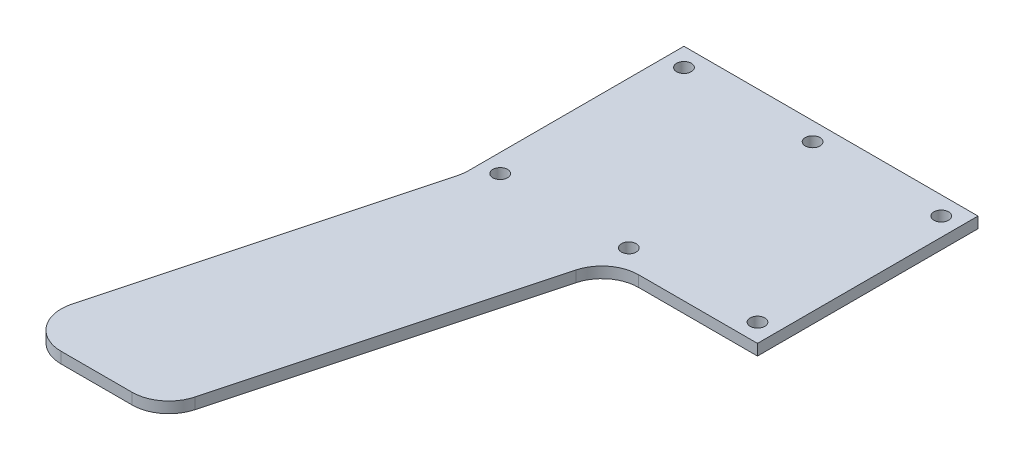
ISO-10303-21;
HEADER;
FILE_DESCRIPTION(('STEP AP214'),'2;1');
FILE_NAME('part.step','',(''),(''),'','','');
FILE_SCHEMA(('AUTOMOTIVE_DESIGN { 1 0 10303 214 1 1 1 1 }'));
ENDSEC;
DATA;
#1=APPLICATION_CONTEXT('core data for automotive mechanical design processes');
#2=APPLICATION_PROTOCOL_DEFINITION('international standard','automotive_design',2000,#1);
#3=PRODUCT_CONTEXT('',#1,'mechanical');
#4=PRODUCT('Part','Part','',(#3));
#5=PRODUCT_RELATED_PRODUCT_CATEGORY('part','',(#4));
#6=PRODUCT_DEFINITION_FORMATION('','',#4);
#7=PRODUCT_DEFINITION_CONTEXT('part definition',#1,'design');
#8=PRODUCT_DEFINITION('design','',#6,#7);
#9=PRODUCT_DEFINITION_SHAPE('','',#8);
#10=(LENGTH_UNIT() NAMED_UNIT(*) SI_UNIT(.MILLI.,.METRE.));
#11=(NAMED_UNIT(*) PLANE_ANGLE_UNIT() SI_UNIT($,.RADIAN.));
#12=(NAMED_UNIT(*) SI_UNIT($,.STERADIAN.) SOLID_ANGLE_UNIT());
#13=UNCERTAINTY_MEASURE_WITH_UNIT(LENGTH_MEASURE(1.E-05),#10,'distance_accuracy_value','');
#14=(GEOMETRIC_REPRESENTATION_CONTEXT(3) GLOBAL_UNCERTAINTY_ASSIGNED_CONTEXT((#13)) GLOBAL_UNIT_ASSIGNED_CONTEXT((#10,
#11,#12)) REPRESENTATION_CONTEXT('',''));
#15=CARTESIAN_POINT('',(0.,0.,0.));
#16=DIRECTION('',(0.,0.,1.));
#17=DIRECTION('',(1.,0.,0.));
#18=AXIS2_PLACEMENT_3D('',#15,#16,#17);
#19=CARTESIAN_POINT('',(0.,3.,0.));
#20=DIRECTION('',(0.,0.,-1.));
#21=DIRECTION('',(-1.,0.,0.));
#22=AXIS2_PLACEMENT_3D('',#19,#20,#21);
#23=PLANE('',#22);
#24=DIRECTION('',(1.,0.,0.));
#25=VECTOR('',#24,1.);
#26=CARTESIAN_POINT('',(0.,3.,0.));
#27=LINE('',#26,#25);
#28=CARTESIAN_POINT('',(47.6732698797896,3.,0.));
#29=VERTEX_POINT('',#28);
#30=CARTESIAN_POINT('',(80.,3.,0.));
#31=VERTEX_POINT('',#30);
#32=EDGE_CURVE('E119',#29,#31,#27,.T.);
#33=ORIENTED_EDGE('',*,*,#32,.F.);
#34=DIRECTION('',(0.,-1.,0.));
#35=VECTOR('',#34,1.);
#36=CARTESIAN_POINT('',(47.6732698797896,3.,0.));
#37=LINE('',#36,#35);
#38=CARTESIAN_POINT('',(47.6732698797896,0.,0.));
#39=VERTEX_POINT('',#38);
#40=EDGE_CURVE('E146',#29,#39,#37,.T.);
#41=ORIENTED_EDGE('',*,*,#40,.T.);
#42=DIRECTION('',(1.,0.,0.));
#43=VECTOR('',#42,1.);
#44=CARTESIAN_POINT('',(0.,0.,0.));
#45=LINE('',#44,#43);
#46=CARTESIAN_POINT('',(80.,0.,0.));
#47=VERTEX_POINT('',#46);
#48=EDGE_CURVE('E144',#39,#47,#45,.T.);
#49=ORIENTED_EDGE('',*,*,#48,.T.);
#50=DIRECTION('',(0.,-1.,0.));
#51=VECTOR('',#50,1.);
#52=CARTESIAN_POINT('',(80.,3.,0.));
#53=LINE('',#52,#51);
#54=EDGE_CURVE('E138',#31,#47,#53,.T.);
#55=ORIENTED_EDGE('',*,*,#54,.F.);
#56=EDGE_LOOP('',(#33,#41,#49,#55));
#57=FACE_BOUND('',#56,.T.);
#58=ADVANCED_FACE('F37',(#57),#23,.F.);
#59=CARTESIAN_POINT('',(80.,3.,0.));
#60=DIRECTION('',(-1.,0.,0.));
#61=DIRECTION('',(0.,0.,1.));
#62=AXIS2_PLACEMENT_3D('',#59,#60,#61);
#63=PLANE('',#62);
#64=DIRECTION('',(0.,0.,-1.));
#65=VECTOR('',#64,1.);
#66=CARTESIAN_POINT('',(80.,0.,0.));
#67=LINE('',#66,#65);
#68=CARTESIAN_POINT('',(80.,0.,-60.));
#69=VERTEX_POINT('',#68);
#70=EDGE_CURVE('E234',#47,#69,#67,.T.);
#71=ORIENTED_EDGE('',*,*,#70,.T.);
#72=DIRECTION('',(0.,-1.,0.));
#73=VECTOR('',#72,1.);
#74=CARTESIAN_POINT('',(80.,3.,-60.));
#75=LINE('',#74,#73);
#76=CARTESIAN_POINT('',(80.,3.,-60.));
#77=VERTEX_POINT('',#76);
#78=EDGE_CURVE('E139',#77,#69,#75,.T.);
#79=ORIENTED_EDGE('',*,*,#78,.F.);
#80=DIRECTION('',(0.,0.,-1.));
#81=VECTOR('',#80,1.);
#82=CARTESIAN_POINT('',(80.,3.,0.));
#83=LINE('',#82,#81);
#84=EDGE_CURVE('E123',#31,#77,#83,.T.);
#85=ORIENTED_EDGE('',*,*,#84,.F.);
#86=ORIENTED_EDGE('',*,*,#54,.T.);
#87=EDGE_LOOP('',(#71,#79,#85,#86));
#88=FACE_BOUND('',#87,.T.);
#89=ADVANCED_FACE('F137',(#88),#63,.F.);
#90=CARTESIAN_POINT('',(0.,3.,-60.));
#91=DIRECTION('',(0.,0.,-1.));
#92=DIRECTION('',(-1.,0.,0.));
#93=AXIS2_PLACEMENT_3D('',#90,#91,#92);
#94=PLANE('',#93);
#95=DIRECTION('',(1.,0.,0.));
#96=VECTOR('',#95,1.);
#97=CARTESIAN_POINT('',(0.,0.,-60.));
#98=LINE('',#97,#96);
#99=CARTESIAN_POINT('',(0.,0.,-60.));
#100=VERTEX_POINT('',#99);
#101=EDGE_CURVE('E196',#100,#69,#98,.T.);
#102=ORIENTED_EDGE('',*,*,#101,.F.);
#103=DIRECTION('',(0.,-1.,0.));
#104=VECTOR('',#103,1.);
#105=CARTESIAN_POINT('',(0.,3.,-60.));
#106=LINE('',#105,#104);
#107=CARTESIAN_POINT('',(0.,3.,-60.));
#108=VERTEX_POINT('',#107);
#109=EDGE_CURVE('E150',#108,#100,#106,.T.);
#110=ORIENTED_EDGE('',*,*,#109,.F.);
#111=DIRECTION('',(1.,0.,0.));
#112=VECTOR('',#111,1.);
#113=CARTESIAN_POINT('',(0.,3.,-60.));
#114=LINE('',#113,#112);
#115=EDGE_CURVE('E141',#108,#77,#114,.T.);
#116=ORIENTED_EDGE('',*,*,#115,.T.);
#117=ORIENTED_EDGE('',*,*,#78,.T.);
#118=EDGE_LOOP('',(#102,#110,#116,#117));
#119=FACE_BOUND('',#118,.T.);
#120=ADVANCED_FACE('F263',(#119),#94,.T.);
#121=CARTESIAN_POINT('',(0.,3.,0.));
#122=DIRECTION('',(-1.,0.,0.));
#123=DIRECTION('',(0.,0.,1.));
#124=AXIS2_PLACEMENT_3D('',#121,#122,#123);
#125=PLANE('',#124);
#126=DIRECTION('',(0.,0.,-1.));
#127=VECTOR('',#126,1.);
#128=CARTESIAN_POINT('',(0.,0.,0.));
#129=LINE('',#128,#127);
#130=CARTESIAN_POINT('',(0.,0.,-1.31652497587397));
#131=VERTEX_POINT('',#130);
#132=EDGE_CURVE('E184',#131,#100,#129,.T.);
#133=ORIENTED_EDGE('',*,*,#132,.F.);
#134=DIRECTION('',(0.,-1.,0.));
#135=VECTOR('',#134,1.);
#136=CARTESIAN_POINT('',(0.,3.,-1.31652497587397));
#137=LINE('',#136,#135);
#138=CARTESIAN_POINT('',(0.,3.,-1.31652497587397));
#139=VERTEX_POINT('',#138);
#140=EDGE_CURVE('E163',#131,#139,#137,.F.);
#141=ORIENTED_EDGE('',*,*,#140,.T.);
#142=DIRECTION('',(0.,0.,-1.));
#143=VECTOR('',#142,1.);
#144=CARTESIAN_POINT('',(0.,3.,0.));
#145=LINE('',#144,#143);
#146=EDGE_CURVE('E202',#139,#108,#145,.T.);
#147=ORIENTED_EDGE('',*,*,#146,.T.);
#148=ORIENTED_EDGE('',*,*,#109,.T.);
#149=EDGE_LOOP('',(#133,#141,#147,#148));
#150=FACE_BOUND('',#149,.T.);
#151=ADVANCED_FACE('F192',(#150),#125,.T.);
#152=CARTESIAN_POINT('',(0.,3.,0.));
#153=DIRECTION('',(0.965925826289067,0.,0.258819045102525));
#154=DIRECTION('',(0.258819045102525,0.,-0.965925826289067));
#155=AXIS2_PLACEMENT_3D('',#152,#153,#154);
#156=PLANE('',#155);
#157=DIRECTION('',(-0.258819045102525,0.,0.965925826289067));
#158=VECTOR('',#157,1.);
#159=CARTESIAN_POINT('',(0.,3.,0.));
#160=LINE('',#159,#158);
#161=CARTESIAN_POINT('',(-0.340741737109329,3.,1.27166547515127));
#162=VERTEX_POINT('',#161);
#163=CARTESIAN_POINT('',(-22.508909044731,3.,84.0043921778815));
#164=VERTEX_POINT('',#163);
#165=EDGE_CURVE('E201',#162,#164,#160,.T.);
#166=ORIENTED_EDGE('',*,*,#165,.F.);
#167=DIRECTION('',(0.,-1.,0.));
#168=VECTOR('',#167,1.);
#169=CARTESIAN_POINT('',(-0.340741737109329,3.,1.27166547515127));
#170=LINE('',#169,#168);
#171=CARTESIAN_POINT('',(-0.340741737109329,0.,1.27166547515127));
#172=VERTEX_POINT('',#171);
#173=EDGE_CURVE('E160',#162,#172,#170,.T.);
#174=ORIENTED_EDGE('',*,*,#173,.T.);
#175=DIRECTION('',(-0.258819045102525,0.,0.965925826289067));
#176=VECTOR('',#175,1.);
#177=CARTESIAN_POINT('',(0.,0.,0.));
#178=LINE('',#177,#176);
#179=CARTESIAN_POINT('',(-22.508909044731,0.,84.0043921778815));
#180=VERTEX_POINT('',#179);
#181=EDGE_CURVE('E187',#172,#180,#178,.T.);
#182=ORIENTED_EDGE('',*,*,#181,.T.);
#183=DIRECTION('',(0.,-1.,0.));
#184=VECTOR('',#183,1.);
#185=CARTESIAN_POINT('',(-22.508909044731,3.,84.0043921778815));
#186=LINE('',#185,#184);
#187=EDGE_CURVE('E158',#180,#164,#186,.F.);
#188=ORIENTED_EDGE('',*,*,#187,.T.);
#189=EDGE_LOOP('',(#166,#174,#182,#188));
#190=FACE_BOUND('',#189,.T.);
#191=ADVANCED_FACE('F204',(#190),#156,.F.);
#192=CARTESIAN_POINT('',(0.,3.,96.5925826289067));
#193=DIRECTION('',(0.,0.,-1.));
#194=DIRECTION('',(-1.,0.,0.));
#195=AXIS2_PLACEMENT_3D('',#192,#193,#194);
#196=PLANE('',#195);
#197=DIRECTION('',(1.,0.,0.));
#198=VECTOR('',#197,1.);
#199=CARTESIAN_POINT('',(0.,3.,96.5925826289067));
#200=LINE('',#199,#198);
#201=CARTESIAN_POINT('',(-12.8496507818404,3.,96.5925826289067));
#202=VERTEX_POINT('',#201);
#203=CARTESIAN_POINT('',(6.44482560995796,3.,96.5925826289067));
#204=VERTEX_POINT('',#203);
#205=EDGE_CURVE('E206',#202,#204,#200,.T.);
#206=ORIENTED_EDGE('',*,*,#205,.F.);
#207=DIRECTION('',(0.,-1.,0.));
#208=VECTOR('',#207,1.);
#209=CARTESIAN_POINT('',(-12.8496507818404,3.,96.5925826289067));
#210=LINE('',#209,#208);
#211=CARTESIAN_POINT('',(-12.8496507818404,0.,96.5925826289067));
#212=VERTEX_POINT('',#211);
#213=EDGE_CURVE('E166',#202,#212,#210,.T.);
#214=ORIENTED_EDGE('',*,*,#213,.T.);
#215=DIRECTION('',(1.,0.,0.));
#216=VECTOR('',#215,1.);
#217=CARTESIAN_POINT('',(0.,0.,96.5925826289067));
#218=LINE('',#217,#216);
#219=CARTESIAN_POINT('',(6.44482560995796,0.,96.5925826289067));
#220=VERTEX_POINT('',#219);
#221=EDGE_CURVE('E238',#212,#220,#218,.T.);
#222=ORIENTED_EDGE('',*,*,#221,.T.);
#223=DIRECTION('',(0.,-1.,0.));
#224=VECTOR('',#223,1.);
#225=CARTESIAN_POINT('',(6.44482560995796,3.,96.5925826289067));
#226=LINE('',#225,#224);
#227=EDGE_CURVE('E52',#220,#204,#226,.F.);
#228=ORIENTED_EDGE('',*,*,#227,.T.);
#229=EDGE_LOOP('',(#206,#214,#222,#228));
#230=FACE_BOUND('',#229,.T.);
#231=ADVANCED_FACE('F293',(#230),#196,.F.);
#232=CARTESIAN_POINT('',(5.,3.,-55.));
#233=DIRECTION('',(0.,-1.,0.));
#234=DIRECTION('',(0.,0.,-1.));
#235=AXIS2_PLACEMENT_3D('',#232,#233,#234);
#236=CYLINDRICAL_SURFACE('',#235,2.);
#237=CARTESIAN_POINT('',(5.,3.,-55.));
#238=DIRECTION('',(0.,1.,0.));
#239=DIRECTION('',(0.,0.,1.));
#240=AXIS2_PLACEMENT_3D('',#237,#238,#239);
#241=CIRCLE('',#240,2.);
#242=CARTESIAN_POINT('',(5.,3.,-53.));
#243=VERTEX_POINT('',#242);
#244=EDGE_CURVE('E132',#243,#243,#241,.T.);
#245=ORIENTED_EDGE('',*,*,#244,.T.);
#246=EDGE_LOOP('',(#245));
#247=FACE_BOUND('',#246,.T.);
#248=CARTESIAN_POINT('',(5.,0.,-55.));
#249=DIRECTION('',(0.,1.,0.));
#250=DIRECTION('',(0.,0.,1.));
#251=AXIS2_PLACEMENT_3D('',#248,#249,#250);
#252=CIRCLE('',#251,2.);
#253=CARTESIAN_POINT('',(5.,0.,-53.));
#254=VERTEX_POINT('',#253);
#255=EDGE_CURVE('E230',#254,#254,#252,.T.);
#256=ORIENTED_EDGE('',*,*,#255,.F.);
#257=EDGE_LOOP('',(#256));
#258=FACE_BOUND('',#257,.T.);
#259=ADVANCED_FACE('F289',(#247,#258),#236,.F.);
#260=CARTESIAN_POINT('',(75.,3.,-55.));
#261=DIRECTION('',(0.,-1.,0.));
#262=DIRECTION('',(0.,0.,-1.));
#263=AXIS2_PLACEMENT_3D('',#260,#261,#262);
#264=CYLINDRICAL_SURFACE('',#263,2.);
#265=CARTESIAN_POINT('',(75.,3.,-55.));
#266=DIRECTION('',(0.,1.,0.));
#267=DIRECTION('',(0.,0.,1.));
#268=AXIS2_PLACEMENT_3D('',#265,#266,#267);
#269=CIRCLE('',#268,2.);
#270=CARTESIAN_POINT('',(75.,3.,-53.));
#271=VERTEX_POINT('',#270);
#272=EDGE_CURVE('E258',#271,#271,#269,.T.);
#273=ORIENTED_EDGE('',*,*,#272,.T.);
#274=EDGE_LOOP('',(#273));
#275=FACE_BOUND('',#274,.T.);
#276=CARTESIAN_POINT('',(75.,0.,-55.));
#277=DIRECTION('',(0.,1.,0.));
#278=DIRECTION('',(0.,0.,1.));
#279=AXIS2_PLACEMENT_3D('',#276,#277,#278);
#280=CIRCLE('',#279,2.);
#281=CARTESIAN_POINT('',(75.,0.,-53.));
#282=VERTEX_POINT('',#281);
#283=EDGE_CURVE('E227',#282,#282,#280,.T.);
#284=ORIENTED_EDGE('',*,*,#283,.F.);
#285=EDGE_LOOP('',(#284));
#286=FACE_BOUND('',#285,.T.);
#287=ADVANCED_FACE('F292',(#275,#286),#264,.F.);
#288=CARTESIAN_POINT('',(75.,3.,-5.));
#289=DIRECTION('',(0.,-1.,0.));
#290=DIRECTION('',(0.,0.,-1.));
#291=AXIS2_PLACEMENT_3D('',#288,#289,#290);
#292=CYLINDRICAL_SURFACE('',#291,2.);
#293=CARTESIAN_POINT('',(75.,3.,-5.));
#294=DIRECTION('',(0.,1.,0.));
#295=DIRECTION('',(0.,0.,1.));
#296=AXIS2_PLACEMENT_3D('',#293,#294,#295);
#297=CIRCLE('',#296,2.);
#298=CARTESIAN_POINT('',(75.,3.,-3.));
#299=VERTEX_POINT('',#298);
#300=EDGE_CURVE('E255',#299,#299,#297,.T.);
#301=ORIENTED_EDGE('',*,*,#300,.T.);
#302=EDGE_LOOP('',(#301));
#303=FACE_BOUND('',#302,.T.);
#304=CARTESIAN_POINT('',(75.,0.,-5.));
#305=DIRECTION('',(0.,1.,0.));
#306=DIRECTION('',(0.,0.,1.));
#307=AXIS2_PLACEMENT_3D('',#304,#305,#306);
#308=CIRCLE('',#307,2.);
#309=CARTESIAN_POINT('',(75.,0.,-3.));
#310=VERTEX_POINT('',#309);
#311=EDGE_CURVE('E224',#310,#310,#308,.T.);
#312=ORIENTED_EDGE('',*,*,#311,.F.);
#313=EDGE_LOOP('',(#312));
#314=FACE_BOUND('',#313,.T.);
#315=ADVANCED_FACE('F297',(#303,#314),#292,.F.);
#316=CARTESIAN_POINT('',(5.,3.,-5.));
#317=DIRECTION('',(0.,-1.,0.));
#318=DIRECTION('',(0.,0.,-1.));
#319=AXIS2_PLACEMENT_3D('',#316,#317,#318);
#320=CYLINDRICAL_SURFACE('',#319,2.);
#321=CARTESIAN_POINT('',(5.,3.,-5.));
#322=DIRECTION('',(0.,1.,0.));
#323=DIRECTION('',(0.,0.,1.));
#324=AXIS2_PLACEMENT_3D('',#321,#322,#323);
#325=CIRCLE('',#324,2.);
#326=CARTESIAN_POINT('',(5.,3.,-3.));
#327=VERTEX_POINT('',#326);
#328=EDGE_CURVE('E250',#327,#327,#325,.T.);
#329=ORIENTED_EDGE('',*,*,#328,.T.);
#330=EDGE_LOOP('',(#329));
#331=FACE_BOUND('',#330,.T.);
#332=CARTESIAN_POINT('',(5.,0.,-5.));
#333=DIRECTION('',(0.,1.,0.));
#334=DIRECTION('',(0.,0.,1.));
#335=AXIS2_PLACEMENT_3D('',#332,#333,#334);
#336=CIRCLE('',#335,2.);
#337=CARTESIAN_POINT('',(5.,0.,-3.));
#338=VERTEX_POINT('',#337);
#339=EDGE_CURVE('E221',#338,#338,#336,.T.);
#340=ORIENTED_EDGE('',*,*,#339,.F.);
#341=EDGE_LOOP('',(#340));
#342=FACE_BOUND('',#341,.T.);
#343=ADVANCED_FACE('F301',(#331,#342),#320,.F.);
#344=CARTESIAN_POINT('',(40.,3.,-55.));
#345=DIRECTION('',(0.,-1.,0.));
#346=DIRECTION('',(0.,0.,-1.));
#347=AXIS2_PLACEMENT_3D('',#344,#345,#346);
#348=CYLINDRICAL_SURFACE('',#347,2.);
#349=CARTESIAN_POINT('',(40.,3.,-55.));
#350=DIRECTION('',(0.,1.,0.));
#351=DIRECTION('',(0.,0.,1.));
#352=AXIS2_PLACEMENT_3D('',#349,#350,#351);
#353=CIRCLE('',#352,2.);
#354=CARTESIAN_POINT('',(40.,3.,-53.));
#355=VERTEX_POINT('',#354);
#356=EDGE_CURVE('E245',#355,#355,#353,.T.);
#357=ORIENTED_EDGE('',*,*,#356,.T.);
#358=EDGE_LOOP('',(#357));
#359=FACE_BOUND('',#358,.T.);
#360=CARTESIAN_POINT('',(40.,0.,-55.));
#361=DIRECTION('',(0.,1.,0.));
#362=DIRECTION('',(0.,0.,1.));
#363=AXIS2_PLACEMENT_3D('',#360,#361,#362);
#364=CIRCLE('',#363,2.);
#365=CARTESIAN_POINT('',(40.,0.,-53.));
#366=VERTEX_POINT('',#365);
#367=EDGE_CURVE('E218',#366,#366,#364,.T.);
#368=ORIENTED_EDGE('',*,*,#367,.F.);
#369=EDGE_LOOP('',(#368));
#370=FACE_BOUND('',#369,.T.);
#371=ADVANCED_FACE('F305',(#359,#370),#348,.F.);
#372=CARTESIAN_POINT('',(40.,3.,-5.));
#373=DIRECTION('',(0.,-1.,0.));
#374=DIRECTION('',(0.,0.,-1.));
#375=AXIS2_PLACEMENT_3D('',#372,#373,#374);
#376=CYLINDRICAL_SURFACE('',#375,2.);
#377=CARTESIAN_POINT('',(40.,3.,-5.));
#378=DIRECTION('',(0.,1.,0.));
#379=DIRECTION('',(0.,0.,1.));
#380=AXIS2_PLACEMENT_3D('',#377,#378,#379);
#381=CIRCLE('',#380,2.);
#382=CARTESIAN_POINT('',(40.,3.,-3.));
#383=VERTEX_POINT('',#382);
#384=EDGE_CURVE('E242',#383,#383,#381,.T.);
#385=ORIENTED_EDGE('',*,*,#384,.T.);
#386=EDGE_LOOP('',(#385));
#387=FACE_BOUND('',#386,.T.);
#388=CARTESIAN_POINT('',(40.,0.,-5.));
#389=DIRECTION('',(0.,1.,0.));
#390=DIRECTION('',(0.,0.,1.));
#391=AXIS2_PLACEMENT_3D('',#388,#389,#390);
#392=CIRCLE('',#391,2.);
#393=CARTESIAN_POINT('',(40.,0.,-3.));
#394=VERTEX_POINT('',#393);
#395=EDGE_CURVE('E215',#394,#394,#392,.T.);
#396=ORIENTED_EDGE('',*,*,#395,.F.);
#397=EDGE_LOOP('',(#396));
#398=FACE_BOUND('',#397,.T.);
#399=ADVANCED_FACE('F308',(#387,#398),#376,.F.);
#400=CARTESIAN_POINT('',(37.3205080756887,3.,10.0000000000001));
#401=DIRECTION('',(0.965925826289067,0.,0.258819045102525));
#402=DIRECTION('',(0.258819045102525,0.,-0.965925826289067));
#403=AXIS2_PLACEMENT_3D('',#400,#401,#402);
#404=PLANE('',#403);
#405=DIRECTION('',(-0.258819045102525,0.,0.965925826289067));
#406=VECTOR('',#405,1.);
#407=CARTESIAN_POINT('',(37.3205080756887,0.,10.0000000000001));
#408=LINE('',#407,#406);
#409=CARTESIAN_POINT('',(38.0140116168989,0.,7.41180954897475));
#410=VERTEX_POINT('',#409);
#411=CARTESIAN_POINT('',(16.1040838728486,0.,89.180773079932));
#412=VERTEX_POINT('',#411);
#413=EDGE_CURVE('E240',#410,#412,#408,.T.);
#414=ORIENTED_EDGE('',*,*,#413,.F.);
#415=DIRECTION('',(0.,-1.,0.));
#416=VECTOR('',#415,1.);
#417=CARTESIAN_POINT('',(38.0140116168989,3.,7.41180954897475));
#418=LINE('',#417,#416);
#419=CARTESIAN_POINT('',(38.0140116168989,3.,7.41180954897475));
#420=VERTEX_POINT('',#419);
#421=EDGE_CURVE('E156',#410,#420,#418,.F.);
#422=ORIENTED_EDGE('',*,*,#421,.T.);
#423=DIRECTION('',(-0.258819045102525,0.,0.965925826289067));
#424=VECTOR('',#423,1.);
#425=CARTESIAN_POINT('',(37.3205080756887,3.,10.0000000000001));
#426=LINE('',#425,#424);
#427=CARTESIAN_POINT('',(16.1040838728486,3.,89.180773079932));
#428=VERTEX_POINT('',#427);
#429=EDGE_CURVE('E208',#420,#428,#426,.T.);
#430=ORIENTED_EDGE('',*,*,#429,.T.);
#431=DIRECTION('',(0.,-1.,0.));
#432=VECTOR('',#431,1.);
#433=CARTESIAN_POINT('',(16.1040838728486,0.,89.180773079932));
#434=LINE('',#433,#432);
#435=EDGE_CURVE('E148',#428,#412,#434,.T.);
#436=ORIENTED_EDGE('',*,*,#435,.T.);
#437=EDGE_LOOP('',(#414,#422,#430,#436));
#438=FACE_BOUND('',#437,.T.);
#439=ADVANCED_FACE('F267',(#438),#404,.T.);
#440=CARTESIAN_POINT('',(0.,3.,0.));
#441=DIRECTION('',(0.,1.,0.));
#442=DIRECTION('',(0.,0.,1.));
#443=AXIS2_PLACEMENT_3D('',#440,#441,#442);
#444=PLANE('',#443);
#445=ORIENTED_EDGE('',*,*,#384,.F.);
#446=EDGE_LOOP('',(#445));
#447=FACE_BOUND('',#446,.T.);
#448=ORIENTED_EDGE('',*,*,#356,.F.);
#449=EDGE_LOOP('',(#448));
#450=FACE_BOUND('',#449,.T.);
#451=ORIENTED_EDGE('',*,*,#328,.F.);
#452=EDGE_LOOP('',(#451));
#453=FACE_BOUND('',#452,.T.);
#454=ORIENTED_EDGE('',*,*,#300,.F.);
#455=EDGE_LOOP('',(#454));
#456=FACE_BOUND('',#455,.T.);
#457=ORIENTED_EDGE('',*,*,#272,.F.);
#458=EDGE_LOOP('',(#457));
#459=FACE_BOUND('',#458,.T.);
#460=ORIENTED_EDGE('',*,*,#244,.F.);
#461=EDGE_LOOP('',(#460));
#462=FACE_BOUND('',#461,.T.);
#463=ORIENTED_EDGE('',*,*,#165,.T.);
#464=CARTESIAN_POINT('',(-12.8496507818404,3.,86.5925826289067));
#465=DIRECTION('',(0.,1.,0.));
#466=DIRECTION('',(0.,0.,1.));
#467=AXIS2_PLACEMENT_3D('',#464,#465,#466);
#468=CIRCLE('',#467,10.);
#469=EDGE_CURVE('E59',#164,#202,#468,.T.);
#470=ORIENTED_EDGE('',*,*,#469,.T.);
#471=ORIENTED_EDGE('',*,*,#205,.T.);
#472=CARTESIAN_POINT('',(6.44482560995796,3.,86.5925826289067));
#473=DIRECTION('',(0.,1.,0.));
#474=DIRECTION('',(0.,0.,1.));
#475=AXIS2_PLACEMENT_3D('',#472,#473,#474);
#476=CIRCLE('',#475,10.);
#477=EDGE_CURVE('E173',#204,#428,#476,.T.);
#478=ORIENTED_EDGE('',*,*,#477,.T.);
#479=ORIENTED_EDGE('',*,*,#429,.F.);
#480=CARTESIAN_POINT('',(47.6732698797896,3.,10.));
#481=DIRECTION('',(0.,1.,0.));
#482=DIRECTION('',(0.,0.,1.));
#483=AXIS2_PLACEMENT_3D('',#480,#481,#482);
#484=CIRCLE('',#483,10.);
#485=EDGE_CURVE('E127',#420,#29,#484,.F.);
#486=ORIENTED_EDGE('',*,*,#485,.T.);
#487=ORIENTED_EDGE('',*,*,#32,.T.);
#488=ORIENTED_EDGE('',*,*,#84,.T.);
#489=ORIENTED_EDGE('',*,*,#115,.F.);
#490=ORIENTED_EDGE('',*,*,#146,.F.);
#491=CARTESIAN_POINT('',(-10.,3.,-1.31652497587397));
#492=DIRECTION('',(0.,1.,0.));
#493=DIRECTION('',(0.,0.,1.));
#494=AXIS2_PLACEMENT_3D('',#491,#492,#493);
#495=CIRCLE('',#494,10.);
#496=EDGE_CURVE('E11',#139,#162,#495,.F.);
#497=ORIENTED_EDGE('',*,*,#496,.T.);
#498=EDGE_LOOP('',(#463,#470,#471,#478,#479,#486,#487,#488,#489,#490,#497));
#499=FACE_BOUND('',#498,.T.);
#500=ADVANCED_FACE('F121',(#447,#450,#453,#456,#459,#462,#499),#444,.T.);
#501=CARTESIAN_POINT('',(0.,0.,0.));
#502=DIRECTION('',(0.,1.,0.));
#503=DIRECTION('',(0.,0.,1.));
#504=AXIS2_PLACEMENT_3D('',#501,#502,#503);
#505=PLANE('',#504);
#506=ORIENTED_EDGE('',*,*,#395,.T.);
#507=EDGE_LOOP('',(#506));
#508=FACE_BOUND('',#507,.T.);
#509=ORIENTED_EDGE('',*,*,#367,.T.);
#510=EDGE_LOOP('',(#509));
#511=FACE_BOUND('',#510,.T.);
#512=ORIENTED_EDGE('',*,*,#339,.T.);
#513=EDGE_LOOP('',(#512));
#514=FACE_BOUND('',#513,.T.);
#515=ORIENTED_EDGE('',*,*,#311,.T.);
#516=EDGE_LOOP('',(#515));
#517=FACE_BOUND('',#516,.T.);
#518=ORIENTED_EDGE('',*,*,#283,.T.);
#519=EDGE_LOOP('',(#518));
#520=FACE_BOUND('',#519,.T.);
#521=ORIENTED_EDGE('',*,*,#255,.T.);
#522=EDGE_LOOP('',(#521));
#523=FACE_BOUND('',#522,.T.);
#524=ORIENTED_EDGE('',*,*,#221,.F.);
#525=CARTESIAN_POINT('',(-12.8496507818404,0.,86.5925826289067));
#526=DIRECTION('',(0.,1.,0.));
#527=DIRECTION('',(0.,0.,1.));
#528=AXIS2_PLACEMENT_3D('',#525,#526,#527);
#529=CIRCLE('',#528,10.);
#530=EDGE_CURVE('E171',#212,#180,#529,.F.);
#531=ORIENTED_EDGE('',*,*,#530,.T.);
#532=ORIENTED_EDGE('',*,*,#181,.F.);
#533=CARTESIAN_POINT('',(-10.,0.,-1.31652497587397));
#534=DIRECTION('',(0.,1.,0.));
#535=DIRECTION('',(0.,0.,1.));
#536=AXIS2_PLACEMENT_3D('',#533,#534,#535);
#537=CIRCLE('',#536,10.);
#538=EDGE_CURVE('E45',#172,#131,#537,.T.);
#539=ORIENTED_EDGE('',*,*,#538,.T.);
#540=ORIENTED_EDGE('',*,*,#132,.T.);
#541=ORIENTED_EDGE('',*,*,#101,.T.);
#542=ORIENTED_EDGE('',*,*,#70,.F.);
#543=ORIENTED_EDGE('',*,*,#48,.F.);
#544=CARTESIAN_POINT('',(47.6732698797896,0.,10.));
#545=DIRECTION('',(0.,1.,0.));
#546=DIRECTION('',(0.,0.,1.));
#547=AXIS2_PLACEMENT_3D('',#544,#545,#546);
#548=CIRCLE('',#547,10.);
#549=EDGE_CURVE('E176',#39,#410,#548,.T.);
#550=ORIENTED_EDGE('',*,*,#549,.T.);
#551=ORIENTED_EDGE('',*,*,#413,.T.);
#552=CARTESIAN_POINT('',(6.44482560995796,0.,86.5925826289067));
#553=DIRECTION('',(0.,1.,0.));
#554=DIRECTION('',(0.,0.,1.));
#555=AXIS2_PLACEMENT_3D('',#552,#553,#554);
#556=CIRCLE('',#555,10.);
#557=EDGE_CURVE('E169',#412,#220,#556,.F.);
#558=ORIENTED_EDGE('',*,*,#557,.T.);
#559=EDGE_LOOP('',(#524,#531,#532,#539,#540,#541,#542,#543,#550,#551,#558));
#560=FACE_BOUND('',#559,.T.);
#561=ADVANCED_FACE('F182',(#508,#511,#514,#517,#520,#523,#560),#505,.F.);
#562=CARTESIAN_POINT('',(47.6732698797896,3.,10.));
#563=DIRECTION('',(0.,-1.,0.));
#564=DIRECTION('',(0.,0.,-1.));
#565=AXIS2_PLACEMENT_3D('',#562,#563,#564);
#566=CYLINDRICAL_SURFACE('',#565,10.);
#567=ORIENTED_EDGE('',*,*,#485,.F.);
#568=ORIENTED_EDGE('',*,*,#421,.F.);
#569=ORIENTED_EDGE('',*,*,#549,.F.);
#570=ORIENTED_EDGE('',*,*,#40,.F.);
#571=EDGE_LOOP('',(#567,#568,#569,#570));
#572=FACE_BOUND('',#571,.T.);
#573=ADVANCED_FACE('F269',(#572),#566,.F.);
#574=CARTESIAN_POINT('',(-10.,3.,-1.31652497587397));
#575=DIRECTION('',(0.,-1.,0.));
#576=DIRECTION('',(0.,0.,-1.));
#577=AXIS2_PLACEMENT_3D('',#574,#575,#576);
#578=CYLINDRICAL_SURFACE('',#577,10.);
#579=ORIENTED_EDGE('',*,*,#496,.F.);
#580=ORIENTED_EDGE('',*,*,#140,.F.);
#581=ORIENTED_EDGE('',*,*,#538,.F.);
#582=ORIENTED_EDGE('',*,*,#173,.F.);
#583=EDGE_LOOP('',(#579,#580,#581,#582));
#584=FACE_BOUND('',#583,.T.);
#585=ADVANCED_FACE('F199',(#584),#578,.F.);
#586=CARTESIAN_POINT('',(-12.8496507818404,3.,86.5925826289067));
#587=DIRECTION('',(0.,-1.,0.));
#588=DIRECTION('',(0.,0.,-1.));
#589=AXIS2_PLACEMENT_3D('',#586,#587,#588);
#590=CYLINDRICAL_SURFACE('',#589,10.);
#591=ORIENTED_EDGE('',*,*,#469,.F.);
#592=ORIENTED_EDGE('',*,*,#187,.F.);
#593=ORIENTED_EDGE('',*,*,#530,.F.);
#594=ORIENTED_EDGE('',*,*,#213,.F.);
#595=EDGE_LOOP('',(#591,#592,#593,#594));
#596=FACE_BOUND('',#595,.T.);
#597=ADVANCED_FACE('F276',(#596),#590,.T.);
#598=CARTESIAN_POINT('',(6.44482560995796,3.,86.5925826289067));
#599=DIRECTION('',(0.,1.,0.));
#600=DIRECTION('',(0.,0.,1.));
#601=AXIS2_PLACEMENT_3D('',#598,#599,#600);
#602=CYLINDRICAL_SURFACE('',#601,10.);
#603=ORIENTED_EDGE('',*,*,#477,.F.);
#604=ORIENTED_EDGE('',*,*,#227,.F.);
#605=ORIENTED_EDGE('',*,*,#557,.F.);
#606=ORIENTED_EDGE('',*,*,#435,.F.);
#607=EDGE_LOOP('',(#603,#604,#605,#606));
#608=FACE_BOUND('',#607,.T.);
#609=ADVANCED_FACE('F39',(#608),#602,.T.);
#610=CLOSED_SHELL('',(#58,#89,#120,#151,#191,#231,#259,#287,#315,#343,#371,#399,#439,#500,#561,
#573,#585,#597,#609));
#611=MANIFOLD_SOLID_BREP('B2',#610);
#612=ADVANCED_BREP_SHAPE_REPRESENTATION('',(#18,#611),#14);
#613=SHAPE_DEFINITION_REPRESENTATION(#9,#612);
ENDSEC;
END-ISO-10303-21;
